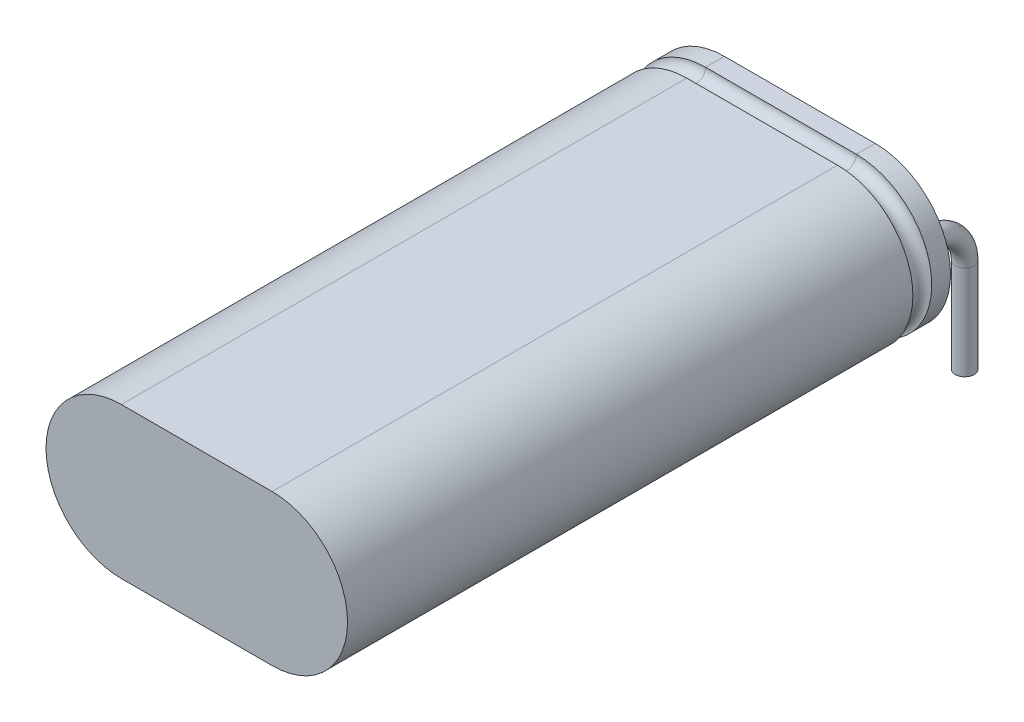
ISO-10303-21;
HEADER;
FILE_DESCRIPTION(('STEP AP214'),'2;1');
FILE_NAME('part.step','',(''),(''),'','','');
FILE_SCHEMA(('AUTOMOTIVE_DESIGN { 1 0 10303 214 1 1 1 1 }'));
ENDSEC;
DATA;
#1=APPLICATION_CONTEXT('core data for automotive mechanical design processes');
#2=APPLICATION_PROTOCOL_DEFINITION('international standard','automotive_design',2000,#1);
#3=PRODUCT_CONTEXT('',#1,'mechanical');
#4=PRODUCT('Part','Part','',(#3));
#5=PRODUCT_RELATED_PRODUCT_CATEGORY('part','',(#4));
#6=PRODUCT_DEFINITION_FORMATION('','',#4);
#7=PRODUCT_DEFINITION_CONTEXT('part definition',#1,'design');
#8=PRODUCT_DEFINITION('design','',#6,#7);
#9=PRODUCT_DEFINITION_SHAPE('','',#8);
#10=(LENGTH_UNIT() NAMED_UNIT(*) SI_UNIT(.MILLI.,.METRE.));
#11=(NAMED_UNIT(*) PLANE_ANGLE_UNIT() SI_UNIT($,.RADIAN.));
#12=(NAMED_UNIT(*) SI_UNIT($,.STERADIAN.) SOLID_ANGLE_UNIT());
#13=UNCERTAINTY_MEASURE_WITH_UNIT(LENGTH_MEASURE(1.E-05),#10,'distance_accuracy_value','');
#14=(GEOMETRIC_REPRESENTATION_CONTEXT(3) GLOBAL_UNCERTAINTY_ASSIGNED_CONTEXT((#13)) GLOBAL_UNIT_ASSIGNED_CONTEXT((#10,
#11,#12)) REPRESENTATION_CONTEXT('',''));
#15=CARTESIAN_POINT('',(0.,0.,0.));
#16=DIRECTION('',(0.,0.,1.));
#17=DIRECTION('',(1.,0.,0.));
#18=AXIS2_PLACEMENT_3D('',#15,#16,#17);
#19=CARTESIAN_POINT('',(0.,-4.,32.));
#20=DIRECTION('',(0.,0.,-1.));
#21=DIRECTION('',(-1.,0.,0.));
#22=AXIS2_PLACEMENT_3D('',#19,#20,#21);
#23=PLANE('',#22);
#24=CARTESIAN_POINT('',(0.,0.,32.));
#25=DIRECTION('',(0.,0.,1.));
#26=DIRECTION('',(1.,0.,0.));
#27=AXIS2_PLACEMENT_3D('',#24,#25,#26);
#28=CIRCLE('',#27,4.);
#29=CARTESIAN_POINT('',(0.,-4.,32.));
#30=VERTEX_POINT('',#29);
#31=CARTESIAN_POINT('',(0.,4.,32.));
#32=VERTEX_POINT('',#31);
#33=EDGE_CURVE('E135',#30,#32,#28,.T.);
#34=ORIENTED_EDGE('',*,*,#33,.T.);
#35=DIRECTION('',(1.,0.,0.));
#36=VECTOR('',#35,1.);
#37=CARTESIAN_POINT('',(-7.99999999999997,4.00000000000006,32.));
#38=LINE('',#37,#36);
#39=CARTESIAN_POINT('',(-7.99999999999997,4.00000000000006,32.));
#40=VERTEX_POINT('',#39);
#41=EDGE_CURVE('E128',#40,#32,#38,.T.);
#42=ORIENTED_EDGE('',*,*,#41,.F.);
#43=CARTESIAN_POINT('',(-8.,0.,32.));
#44=DIRECTION('',(0.,0.,-1.));
#45=DIRECTION('',(-1.,0.,0.));
#46=AXIS2_PLACEMENT_3D('',#43,#44,#45);
#47=CIRCLE('',#46,4.);
#48=CARTESIAN_POINT('',(-8.00000000000003,-3.99999999999994,32.));
#49=VERTEX_POINT('',#48);
#50=EDGE_CURVE('E132',#49,#40,#47,.T.);
#51=ORIENTED_EDGE('',*,*,#50,.F.);
#52=DIRECTION('',(1.,0.,0.));
#53=VECTOR('',#52,1.);
#54=CARTESIAN_POINT('',(-8.00000000000003,-3.99999999999994,32.));
#55=LINE('',#54,#53);
#56=EDGE_CURVE('E138',#49,#30,#55,.T.);
#57=ORIENTED_EDGE('',*,*,#56,.T.);
#58=EDGE_LOOP('',(#34,#42,#51,#57));
#59=FACE_BOUND('',#58,.T.);
#60=ADVANCED_FACE('F59',(#59),#23,.F.);
#61=CARTESIAN_POINT('',(0.,-4.,0.));
#62=DIRECTION('',(0.,0.,1.));
#63=DIRECTION('',(1.,0.,0.));
#64=AXIS2_PLACEMENT_3D('',#61,#62,#63);
#65=PLANE('',#64);
#66=CARTESIAN_POINT('',(-9.75,0.,0.));
#67=DIRECTION('',(0.,0.,1.));
#68=DIRECTION('',(1.,0.,0.));
#69=AXIS2_PLACEMENT_3D('',#66,#67,#68);
#70=CIRCLE('',#69,0.5);
#71=CARTESIAN_POINT('',(-9.25,0.,0.));
#72=VERTEX_POINT('',#71);
#73=EDGE_CURVE('E12',#72,#72,#70,.F.);
#74=ORIENTED_EDGE('',*,*,#73,.F.);
#75=EDGE_LOOP('',(#74));
#76=FACE_BOUND('',#75,.T.);
#77=CARTESIAN_POINT('',(1.75,0.,0.));
#78=DIRECTION('',(0.,0.,1.));
#79=DIRECTION('',(-1.,0.,0.));
#80=AXIS2_PLACEMENT_3D('',#77,#78,#79);
#81=CIRCLE('',#80,0.5);
#82=CARTESIAN_POINT('',(1.25,0.,0.));
#83=VERTEX_POINT('',#82);
#84=EDGE_CURVE('E425',#83,#83,#81,.T.);
#85=ORIENTED_EDGE('',*,*,#84,.T.);
#86=EDGE_LOOP('',(#85));
#87=FACE_BOUND('',#86,.T.);
#88=CARTESIAN_POINT('',(0.,0.,0.));
#89=DIRECTION('',(0.,0.,1.));
#90=DIRECTION('',(1.,0.,0.));
#91=AXIS2_PLACEMENT_3D('',#88,#89,#90);
#92=CIRCLE('',#91,4.);
#93=CARTESIAN_POINT('',(0.,-4.,0.));
#94=VERTEX_POINT('',#93);
#95=CARTESIAN_POINT('',(0.,4.,0.));
#96=VERTEX_POINT('',#95);
#97=EDGE_CURVE('E67',#94,#96,#92,.T.);
#98=ORIENTED_EDGE('',*,*,#97,.F.);
#99=DIRECTION('',(1.,0.,0.));
#100=VECTOR('',#99,1.);
#101=CARTESIAN_POINT('',(-8.00000000000003,-3.99999999999994,0.));
#102=LINE('',#101,#100);
#103=CARTESIAN_POINT('',(-8.,-3.99999999999994,0.));
#104=VERTEX_POINT('',#103);
#105=EDGE_CURVE('E178',#104,#94,#102,.T.);
#106=ORIENTED_EDGE('',*,*,#105,.F.);
#107=CARTESIAN_POINT('',(-8.,0.,0.));
#108=DIRECTION('',(0.,0.,-1.));
#109=DIRECTION('',(-1.,0.,0.));
#110=AXIS2_PLACEMENT_3D('',#107,#108,#109);
#111=CIRCLE('',#110,4.);
#112=CARTESIAN_POINT('',(-7.99999999999997,4.00000000000006,0.));
#113=VERTEX_POINT('',#112);
#114=EDGE_CURVE('E208',#104,#113,#111,.T.);
#115=ORIENTED_EDGE('',*,*,#114,.T.);
#116=DIRECTION('',(1.,0.,0.));
#117=VECTOR('',#116,1.);
#118=CARTESIAN_POINT('',(-7.99999999999997,4.00000000000006,0.));
#119=LINE('',#118,#117);
#120=EDGE_CURVE('E113',#113,#96,#119,.T.);
#121=ORIENTED_EDGE('',*,*,#120,.T.);
#122=EDGE_LOOP('',(#98,#106,#115,#121));
#123=FACE_BOUND('',#122,.T.);
#124=ADVANCED_FACE('F61',(#76,#87,#123),#65,.F.);
#125=CARTESIAN_POINT('',(0.,0.,32.6039338114605));
#126=DIRECTION('',(0.,0.,1.));
#127=DIRECTION('',(1.,0.,0.));
#128=AXIS2_PLACEMENT_3D('',#125,#126,#127);
#129=CYLINDRICAL_SURFACE('',#128,4.);
#130=CARTESIAN_POINT('',(0.,0.,1.));
#131=DIRECTION('',(0.,0.,1.));
#132=DIRECTION('',(1.,0.,0.));
#133=AXIS2_PLACEMENT_3D('',#130,#131,#132);
#134=CIRCLE('',#133,4.);
#135=CARTESIAN_POINT('',(0.,-4.,1.));
#136=VERTEX_POINT('',#135);
#137=CARTESIAN_POINT('',(0.,4.,1.));
#138=VERTEX_POINT('',#137);
#139=EDGE_CURVE('E197',#136,#138,#134,.T.);
#140=ORIENTED_EDGE('',*,*,#139,.F.);
#141=DIRECTION('',(0.,0.,1.));
#142=VECTOR('',#141,1.);
#143=CARTESIAN_POINT('',(0.,-4.,1.));
#144=LINE('',#143,#142);
#145=EDGE_CURVE('E187',#94,#136,#144,.T.);
#146=ORIENTED_EDGE('',*,*,#145,.F.);
#147=ORIENTED_EDGE('',*,*,#97,.T.);
#148=DIRECTION('',(0.,0.,1.));
#149=VECTOR('',#148,1.);
#150=CARTESIAN_POINT('',(0.,4.,1.));
#151=LINE('',#150,#149);
#152=EDGE_CURVE('E181',#96,#138,#151,.T.);
#153=ORIENTED_EDGE('',*,*,#152,.T.);
#154=EDGE_LOOP('',(#140,#146,#147,#153));
#155=FACE_BOUND('',#154,.T.);
#156=ADVANCED_FACE('F204',(#155),#129,.T.);
#157=CARTESIAN_POINT('',(0.,0.,1.5));
#158=DIRECTION('',(0.,0.,1.));
#159=DIRECTION('',(1.,0.,0.));
#160=AXIS2_PLACEMENT_3D('',#157,#158,#159);
#161=TOROIDAL_SURFACE('',#160,4.,0.5);
#162=CARTESIAN_POINT('',(0.,0.,2.));
#163=DIRECTION('',(0.,0.,1.));
#164=DIRECTION('',(1.,0.,0.));
#165=AXIS2_PLACEMENT_3D('',#162,#163,#164);
#166=CIRCLE('',#165,4.);
#167=CARTESIAN_POINT('',(0.,-4.,2.));
#168=VERTEX_POINT('',#167);
#169=CARTESIAN_POINT('',(0.,4.,2.));
#170=VERTEX_POINT('',#169);
#171=EDGE_CURVE('E194',#168,#170,#166,.T.);
#172=ORIENTED_EDGE('',*,*,#171,.F.);
#173=CARTESIAN_POINT('',(0.,-4.,1.5));
#174=DIRECTION('',(1.,0.,0.));
#175=DIRECTION('',(0.,0.,-1.));
#176=AXIS2_PLACEMENT_3D('',#173,#174,#175);
#177=CIRCLE('',#176,0.5);
#178=EDGE_CURVE('E189',#136,#168,#177,.T.);
#179=ORIENTED_EDGE('',*,*,#178,.F.);
#180=ORIENTED_EDGE('',*,*,#139,.T.);
#181=CARTESIAN_POINT('',(0.,4.,1.5));
#182=DIRECTION('',(-1.,0.,0.));
#183=DIRECTION('',(0.,0.,-1.));
#184=AXIS2_PLACEMENT_3D('',#181,#182,#183);
#185=CIRCLE('',#184,0.5);
#186=EDGE_CURVE('E107',#138,#170,#185,.T.);
#187=ORIENTED_EDGE('',*,*,#186,.T.);
#188=EDGE_LOOP('',(#172,#179,#180,#187));
#189=FACE_BOUND('',#188,.T.);
#190=ADVANCED_FACE('F214',(#189),#161,.F.);
#191=CARTESIAN_POINT('',(0.,0.,32.6039338114605));
#192=DIRECTION('',(0.,0.,1.));
#193=DIRECTION('',(1.,0.,0.));
#194=AXIS2_PLACEMENT_3D('',#191,#192,#193);
#195=CYLINDRICAL_SURFACE('',#194,4.);
#196=DIRECTION('',(0.,0.,1.));
#197=VECTOR('',#196,1.);
#198=CARTESIAN_POINT('',(0.,-4.,32.));
#199=LINE('',#198,#197);
#200=EDGE_CURVE('E191',#168,#30,#199,.T.);
#201=ORIENTED_EDGE('',*,*,#200,.F.);
#202=ORIENTED_EDGE('',*,*,#171,.T.);
#203=DIRECTION('',(0.,0.,1.));
#204=VECTOR('',#203,1.);
#205=CARTESIAN_POINT('',(0.,4.,32.));
#206=LINE('',#205,#204);
#207=EDGE_CURVE('E185',#170,#32,#206,.T.);
#208=ORIENTED_EDGE('',*,*,#207,.T.);
#209=ORIENTED_EDGE('',*,*,#33,.F.);
#210=EDGE_LOOP('',(#201,#202,#208,#209));
#211=FACE_BOUND('',#210,.T.);
#212=ADVANCED_FACE('F236',(#211),#195,.T.);
#213=CARTESIAN_POINT('',(-7.99999999999997,4.00000000000006,1.));
#214=DIRECTION('',(0.,-1.,0.));
#215=DIRECTION('',(1.,0.,0.));
#216=AXIS2_PLACEMENT_3D('',#213,#214,#215);
#217=PLANE('',#216);
#218=ORIENTED_EDGE('',*,*,#152,.F.);
#219=ORIENTED_EDGE('',*,*,#120,.F.);
#220=DIRECTION('',(0.,0.,-1.));
#221=VECTOR('',#220,1.);
#222=CARTESIAN_POINT('',(-7.99999999999997,4.00000000000006,1.));
#223=LINE('',#222,#221);
#224=CARTESIAN_POINT('',(-7.99999999999997,4.00000000000006,1.));
#225=VERTEX_POINT('',#224);
#226=EDGE_CURVE('E150',#225,#113,#223,.T.);
#227=ORIENTED_EDGE('',*,*,#226,.F.);
#228=DIRECTION('',(1.,0.,0.));
#229=VECTOR('',#228,1.);
#230=CARTESIAN_POINT('',(-7.99999999999997,4.00000000000006,1.));
#231=LINE('',#230,#229);
#232=EDGE_CURVE('E80',#225,#138,#231,.T.);
#233=ORIENTED_EDGE('',*,*,#232,.T.);
#234=EDGE_LOOP('',(#218,#219,#227,#233));
#235=FACE_BOUND('',#234,.T.);
#236=ADVANCED_FACE('F209',(#235),#217,.F.);
#237=CARTESIAN_POINT('',(-8.00000000000003,-3.99999999999994,0.));
#238=DIRECTION('',(0.,1.,0.));
#239=DIRECTION('',(-1.,0.,0.));
#240=AXIS2_PLACEMENT_3D('',#237,#238,#239);
#241=PLANE('',#240);
#242=ORIENTED_EDGE('',*,*,#145,.T.);
#243=DIRECTION('',(1.,0.,0.));
#244=VECTOR('',#243,1.);
#245=CARTESIAN_POINT('',(-8.00000000000003,-3.99999999999994,1.));
#246=LINE('',#245,#244);
#247=CARTESIAN_POINT('',(-8.00000000000003,-3.99999999999994,1.));
#248=VERTEX_POINT('',#247);
#249=EDGE_CURVE('E175',#248,#136,#246,.T.);
#250=ORIENTED_EDGE('',*,*,#249,.F.);
#251=DIRECTION('',(0.,0.,1.));
#252=VECTOR('',#251,1.);
#253=CARTESIAN_POINT('',(-8.00000000000003,-3.99999999999994,0.));
#254=LINE('',#253,#252);
#255=EDGE_CURVE('E154',#104,#248,#254,.T.);
#256=ORIENTED_EDGE('',*,*,#255,.F.);
#257=ORIENTED_EDGE('',*,*,#105,.T.);
#258=EDGE_LOOP('',(#242,#250,#256,#257));
#259=FACE_BOUND('',#258,.T.);
#260=ADVANCED_FACE('F228',(#259),#241,.F.);
#261=CARTESIAN_POINT('',(-8.00000000000003,-3.99999999999994,1.5));
#262=DIRECTION('',(1.,0.,0.));
#263=DIRECTION('',(0.,1.,0.));
#264=AXIS2_PLACEMENT_3D('',#261,#262,#263);
#265=CYLINDRICAL_SURFACE('',#264,0.5);
#266=ORIENTED_EDGE('',*,*,#178,.T.);
#267=DIRECTION('',(1.,0.,0.));
#268=VECTOR('',#267,1.);
#269=CARTESIAN_POINT('',(-8.00000000000003,-3.99999999999994,2.));
#270=LINE('',#269,#268);
#271=CARTESIAN_POINT('',(-8.00000000000003,-3.99999999999994,2.));
#272=VERTEX_POINT('',#271);
#273=EDGE_CURVE('E172',#272,#168,#270,.T.);
#274=ORIENTED_EDGE('',*,*,#273,.F.);
#275=CARTESIAN_POINT('',(-8.00000000000003,-3.99999999999994,1.5));
#276=DIRECTION('',(1.,0.,0.));
#277=DIRECTION('',(0.,1.,0.));
#278=AXIS2_PLACEMENT_3D('',#275,#276,#277);
#279=CIRCLE('',#278,0.5);
#280=EDGE_CURVE('E163',#248,#272,#279,.T.);
#281=ORIENTED_EDGE('',*,*,#280,.F.);
#282=ORIENTED_EDGE('',*,*,#249,.T.);
#283=EDGE_LOOP('',(#266,#274,#281,#282));
#284=FACE_BOUND('',#283,.T.);
#285=ADVANCED_FACE('F217',(#284),#265,.F.);
#286=CARTESIAN_POINT('',(-8.00000000000003,-3.99999999999994,2.));
#287=DIRECTION('',(0.,1.,0.));
#288=DIRECTION('',(-1.,0.,0.));
#289=AXIS2_PLACEMENT_3D('',#286,#287,#288);
#290=PLANE('',#289);
#291=ORIENTED_EDGE('',*,*,#200,.T.);
#292=ORIENTED_EDGE('',*,*,#56,.F.);
#293=DIRECTION('',(0.,0.,1.));
#294=VECTOR('',#293,1.);
#295=CARTESIAN_POINT('',(-8.00000000000003,-3.99999999999994,2.));
#296=LINE('',#295,#294);
#297=EDGE_CURVE('E146',#272,#49,#296,.T.);
#298=ORIENTED_EDGE('',*,*,#297,.F.);
#299=ORIENTED_EDGE('',*,*,#273,.T.);
#300=EDGE_LOOP('',(#291,#292,#298,#299));
#301=FACE_BOUND('',#300,.T.);
#302=ADVANCED_FACE('F220',(#301),#290,.F.);
#303=CARTESIAN_POINT('',(-7.99999999999997,4.00000000000006,32.));
#304=DIRECTION('',(0.,-1.,0.));
#305=DIRECTION('',(1.,0.,0.));
#306=AXIS2_PLACEMENT_3D('',#303,#304,#305);
#307=PLANE('',#306);
#308=ORIENTED_EDGE('',*,*,#207,.F.);
#309=DIRECTION('',(1.,0.,0.));
#310=VECTOR('',#309,1.);
#311=CARTESIAN_POINT('',(-7.99999999999997,4.00000000000006,2.));
#312=LINE('',#311,#310);
#313=CARTESIAN_POINT('',(-7.99999999999997,4.00000000000006,2.));
#314=VERTEX_POINT('',#313);
#315=EDGE_CURVE('E74',#314,#170,#312,.T.);
#316=ORIENTED_EDGE('',*,*,#315,.F.);
#317=DIRECTION('',(0.,0.,-1.));
#318=VECTOR('',#317,1.);
#319=CARTESIAN_POINT('',(-7.99999999999997,4.00000000000006,32.));
#320=LINE('',#319,#318);
#321=EDGE_CURVE('E141',#40,#314,#320,.T.);
#322=ORIENTED_EDGE('',*,*,#321,.F.);
#323=ORIENTED_EDGE('',*,*,#41,.T.);
#324=EDGE_LOOP('',(#308,#316,#322,#323));
#325=FACE_BOUND('',#324,.T.);
#326=ADVANCED_FACE('F142',(#325),#307,.F.);
#327=CARTESIAN_POINT('',(-7.99999999999997,4.00000000000005,1.5));
#328=DIRECTION('',(1.,0.,0.));
#329=DIRECTION('',(0.,1.,0.));
#330=AXIS2_PLACEMENT_3D('',#327,#328,#329);
#331=CYLINDRICAL_SURFACE('',#330,0.5);
#332=ORIENTED_EDGE('',*,*,#186,.F.);
#333=ORIENTED_EDGE('',*,*,#232,.F.);
#334=CARTESIAN_POINT('',(-7.99999999999997,4.00000000000005,1.5));
#335=DIRECTION('',(1.,0.,0.));
#336=DIRECTION('',(0.,1.,0.));
#337=AXIS2_PLACEMENT_3D('',#334,#335,#336);
#338=CIRCLE('',#337,0.5);
#339=EDGE_CURVE('E145',#314,#225,#338,.T.);
#340=ORIENTED_EDGE('',*,*,#339,.F.);
#341=ORIENTED_EDGE('',*,*,#315,.T.);
#342=EDGE_LOOP('',(#332,#333,#340,#341));
#343=FACE_BOUND('',#342,.T.);
#344=ADVANCED_FACE('F296',(#343),#331,.F.);
#345=CARTESIAN_POINT('',(-8.,0.,-3.04390968703917));
#346=DIRECTION('',(0.,0.,-1.));
#347=DIRECTION('',(-1.,0.,0.));
#348=AXIS2_PLACEMENT_3D('',#345,#346,#347);
#349=CYLINDRICAL_SURFACE('',#348,4.);
#350=CARTESIAN_POINT('',(-8.,0.,2.));
#351=DIRECTION('',(0.,0.,-1.));
#352=DIRECTION('',(-1.,0.,0.));
#353=AXIS2_PLACEMENT_3D('',#350,#351,#352);
#354=CIRCLE('',#353,4.);
#355=EDGE_CURVE('E151',#272,#314,#354,.T.);
#356=ORIENTED_EDGE('',*,*,#355,.F.);
#357=ORIENTED_EDGE('',*,*,#297,.T.);
#358=ORIENTED_EDGE('',*,*,#50,.T.);
#359=ORIENTED_EDGE('',*,*,#321,.T.);
#360=EDGE_LOOP('',(#356,#357,#358,#359));
#361=FACE_BOUND('',#360,.T.);
#362=ADVANCED_FACE('F148',(#361),#349,.T.);
#363=CARTESIAN_POINT('',(-8.,0.,1.5));
#364=DIRECTION('',(0.,0.,-1.));
#365=DIRECTION('',(-1.,0.,0.));
#366=AXIS2_PLACEMENT_3D('',#363,#364,#365);
#367=TOROIDAL_SURFACE('',#366,4.,0.5);
#368=CARTESIAN_POINT('',(-8.,0.,0.999999999999999));
#369=DIRECTION('',(0.,0.,-1.));
#370=DIRECTION('',(-1.,0.,0.));
#371=AXIS2_PLACEMENT_3D('',#368,#369,#370);
#372=CIRCLE('',#371,4.);
#373=EDGE_CURVE('E157',#248,#225,#372,.T.);
#374=ORIENTED_EDGE('',*,*,#373,.F.);
#375=ORIENTED_EDGE('',*,*,#280,.T.);
#376=ORIENTED_EDGE('',*,*,#355,.T.);
#377=ORIENTED_EDGE('',*,*,#339,.T.);
#378=EDGE_LOOP('',(#374,#375,#376,#377));
#379=FACE_BOUND('',#378,.T.);
#380=ADVANCED_FACE('F223',(#379),#367,.F.);
#381=CARTESIAN_POINT('',(-8.,0.,-3.04390968703917));
#382=DIRECTION('',(0.,0.,-1.));
#383=DIRECTION('',(-1.,0.,0.));
#384=AXIS2_PLACEMENT_3D('',#381,#382,#383);
#385=CYLINDRICAL_SURFACE('',#384,4.);
#386=ORIENTED_EDGE('',*,*,#114,.F.);
#387=ORIENTED_EDGE('',*,*,#255,.T.);
#388=ORIENTED_EDGE('',*,*,#373,.T.);
#389=ORIENTED_EDGE('',*,*,#226,.T.);
#390=EDGE_LOOP('',(#386,#387,#388,#389));
#391=FACE_BOUND('',#390,.T.);
#392=ADVANCED_FACE('F226',(#391),#385,.T.);
#393=CARTESIAN_POINT('',(1.74999999999995,-7.00000000000001,-3.));
#394=DIRECTION('',(0.,1.,0.));
#395=DIRECTION('',(-1.,0.,0.));
#396=AXIS2_PLACEMENT_3D('',#393,#394,#395);
#397=PLANE('',#396);
#398=CARTESIAN_POINT('',(1.74999999999995,-7.00000000000001,-3.));
#399=DIRECTION('',(0.,1.,0.));
#400=DIRECTION('',(-1.,0.,0.));
#401=AXIS2_PLACEMENT_3D('',#398,#399,#400);
#402=CIRCLE('',#401,0.5);
#403=CARTESIAN_POINT('',(1.24999999999995,-7.00000000000001,-3.));
#404=VERTEX_POINT('',#403);
#405=EDGE_CURVE('E438',#404,#404,#402,.T.);
#406=ORIENTED_EDGE('',*,*,#405,.F.);
#407=EDGE_LOOP('',(#406));
#408=FACE_BOUND('',#407,.T.);
#409=ADVANCED_FACE('F330',(#408),#397,.F.);
#410=CARTESIAN_POINT('',(1.75,0.,0.));
#411=DIRECTION('',(0.,0.,-1.));
#412=DIRECTION('',(-1.,0.,0.));
#413=AXIS2_PLACEMENT_3D('',#410,#411,#412);
#414=CYLINDRICAL_SURFACE('',#413,0.5);
#415=CARTESIAN_POINT('',(1.75,0.,-1.));
#416=DIRECTION('',(0.,0.,1.));
#417=DIRECTION('',(-1.,0.,0.));
#418=AXIS2_PLACEMENT_3D('',#415,#416,#417);
#419=CIRCLE('',#418,0.5);
#420=CARTESIAN_POINT('',(1.75,0.499999999999987,-1.));
#421=VERTEX_POINT('',#420);
#422=EDGE_CURVE('E432',#421,#421,#419,.T.);
#423=ORIENTED_EDGE('',*,*,#422,.T.);
#424=EDGE_LOOP('',(#423));
#425=FACE_BOUND('',#424,.T.);
#426=ORIENTED_EDGE('',*,*,#84,.F.);
#427=EDGE_LOOP('',(#426));
#428=FACE_BOUND('',#427,.T.);
#429=ADVANCED_FACE('F340',(#425,#428),#414,.T.);
#430=CARTESIAN_POINT('',(1.74999999999999,-2.00000000000001,-1.));
#431=DIRECTION('',(-1.,0.,0.));
#432=DIRECTION('',(0.,-1.,0.));
#433=AXIS2_PLACEMENT_3D('',#430,#431,#432);
#434=TOROIDAL_SURFACE('',#433,2.,0.5);
#435=CARTESIAN_POINT('',(1.74999999999999,-2.00000000000001,-3.));
#436=DIRECTION('',(0.,1.,0.));
#437=DIRECTION('',(-1.,0.,0.));
#438=AXIS2_PLACEMENT_3D('',#435,#436,#437);
#439=CIRCLE('',#438,0.5);
#440=CARTESIAN_POINT('',(1.74999999999999,-2.00000000000001,-3.5));
#441=VERTEX_POINT('',#440);
#442=EDGE_CURVE('E435',#441,#441,#439,.T.);
#443=CARTESIAN_POINT('',(1.74999999999999,-2.00000000000001,-1.));
#444=DIRECTION('',(-1.,0.,0.));
#445=DIRECTION('',(0.,-1.,0.));
#446=AXIS2_PLACEMENT_3D('',#443,#444,#445);
#447=CIRCLE('',#446,2.5);
#448=EDGE_CURVE('',#421,#441,#447,.T.);
#449=ORIENTED_EDGE('',*,*,#422,.F.);
#450=ORIENTED_EDGE('',*,*,#442,.T.);
#451=ORIENTED_EDGE('',*,*,#448,.T.);
#452=ORIENTED_EDGE('',*,*,#448,.F.);
#453=EDGE_LOOP('',(#449,#451,#450,#452));
#454=FACE_BOUND('',#453,.T.);
#455=ADVANCED_FACE('F351',(#454),#434,.T.);
#456=CARTESIAN_POINT('',(1.74999999999999,-2.00000000000001,-3.));
#457=DIRECTION('',(0.,-1.,0.));
#458=DIRECTION('',(1.,0.,0.));
#459=AXIS2_PLACEMENT_3D('',#456,#457,#458);
#460=CYLINDRICAL_SURFACE('',#459,0.5);
#461=ORIENTED_EDGE('',*,*,#405,.T.);
#462=EDGE_LOOP('',(#461));
#463=FACE_BOUND('',#462,.T.);
#464=ORIENTED_EDGE('',*,*,#442,.F.);
#465=EDGE_LOOP('',(#464));
#466=FACE_BOUND('',#465,.T.);
#467=ADVANCED_FACE('F332',(#463,#466),#460,.T.);
#468=CARTESIAN_POINT('',(-9.75000000000005,-6.99999999999993,-3.));
#469=DIRECTION('',(0.,1.,0.));
#470=DIRECTION('',(-1.,0.,0.));
#471=AXIS2_PLACEMENT_3D('',#468,#469,#470);
#472=PLANE('',#471);
#473=CARTESIAN_POINT('',(-9.75000000000005,-6.99999999999993,-3.));
#474=DIRECTION('',(0.,1.,0.));
#475=DIRECTION('',(-1.,0.,0.));
#476=AXIS2_PLACEMENT_3D('',#473,#474,#475);
#477=CIRCLE('',#476,0.5);
#478=CARTESIAN_POINT('',(-10.25,-6.99999999999993,-3.));
#479=VERTEX_POINT('',#478);
#480=EDGE_CURVE('E419',#479,#479,#477,.T.);
#481=ORIENTED_EDGE('',*,*,#480,.F.);
#482=EDGE_LOOP('',(#481));
#483=FACE_BOUND('',#482,.T.);
#484=ADVANCED_FACE('F369',(#483),#472,.F.);
#485=CARTESIAN_POINT('',(-9.75,0.,0.));
#486=DIRECTION('',(0.,0.,-1.));
#487=DIRECTION('',(0.,1.,0.));
#488=AXIS2_PLACEMENT_3D('',#485,#486,#487);
#489=CYLINDRICAL_SURFACE('',#488,0.5);
#490=CARTESIAN_POINT('',(-9.75,0.,-1.));
#491=DIRECTION('',(0.,0.,1.));
#492=DIRECTION('',(-1.,0.,0.));
#493=AXIS2_PLACEMENT_3D('',#490,#491,#492);
#494=CIRCLE('',#493,0.5);
#495=CARTESIAN_POINT('',(-9.75,0.500000000000069,-1.));
#496=VERTEX_POINT('',#495);
#497=EDGE_CURVE('E423',#496,#496,#494,.T.);
#498=ORIENTED_EDGE('',*,*,#497,.T.);
#499=EDGE_LOOP('',(#498));
#500=FACE_BOUND('',#499,.T.);
#501=ORIENTED_EDGE('',*,*,#73,.T.);
#502=EDGE_LOOP('',(#501));
#503=FACE_BOUND('',#502,.T.);
#504=ADVANCED_FACE('F383',(#500,#503),#489,.T.);
#505=CARTESIAN_POINT('',(-9.75000000000001,-1.99999999999993,-1.));
#506=DIRECTION('',(-1.,0.,0.));
#507=DIRECTION('',(0.,-1.,0.));
#508=AXIS2_PLACEMENT_3D('',#505,#506,#507);
#509=TOROIDAL_SURFACE('',#508,2.,0.5);
#510=CARTESIAN_POINT('',(-9.75000000000001,-1.99999999999993,-3.));
#511=DIRECTION('',(0.,1.,0.));
#512=DIRECTION('',(-1.,0.,0.));
#513=AXIS2_PLACEMENT_3D('',#510,#511,#512);
#514=CIRCLE('',#513,0.5);
#515=CARTESIAN_POINT('',(-9.75000000000001,-1.99999999999993,-3.5));
#516=VERTEX_POINT('',#515);
#517=EDGE_CURVE('E422',#516,#516,#514,.T.);
#518=CARTESIAN_POINT('',(-9.75000000000001,-1.99999999999993,-1.));
#519=DIRECTION('',(-1.,0.,0.));
#520=DIRECTION('',(0.,-1.,0.));
#521=AXIS2_PLACEMENT_3D('',#518,#519,#520);
#522=CIRCLE('',#521,2.5);
#523=EDGE_CURVE('',#496,#516,#522,.T.);
#524=ORIENTED_EDGE('',*,*,#497,.F.);
#525=ORIENTED_EDGE('',*,*,#517,.T.);
#526=ORIENTED_EDGE('',*,*,#523,.T.);
#527=ORIENTED_EDGE('',*,*,#523,.F.);
#528=EDGE_LOOP('',(#524,#526,#525,#527));
#529=FACE_BOUND('',#528,.T.);
#530=ADVANCED_FACE('F393',(#529),#509,.T.);
#531=CARTESIAN_POINT('',(-9.75000000000001,-1.99999999999993,-3.));
#532=DIRECTION('',(0.,-1.,0.));
#533=DIRECTION('',(1.,0.,0.));
#534=AXIS2_PLACEMENT_3D('',#531,#532,#533);
#535=CYLINDRICAL_SURFACE('',#534,0.5);
#536=ORIENTED_EDGE('',*,*,#480,.T.);
#537=EDGE_LOOP('',(#536));
#538=FACE_BOUND('',#537,.T.);
#539=ORIENTED_EDGE('',*,*,#517,.F.);
#540=EDGE_LOOP('',(#539));
#541=FACE_BOUND('',#540,.T.);
#542=ADVANCED_FACE('F343',(#538,#541),#535,.T.);
#543=CLOSED_SHELL('',(#60,#124,#156,#190,#212,#236,#260,#285,#302,#326,#344,#362,#380,#392,#409,
#429,#455,#467,#484,#504,#530,#542));
#544=MANIFOLD_SOLID_BREP('B2',#543);
#545=ADVANCED_BREP_SHAPE_REPRESENTATION('',(#18,#544),#14);
#546=SHAPE_DEFINITION_REPRESENTATION(#9,#545);
ENDSEC;
END-ISO-10303-21;
